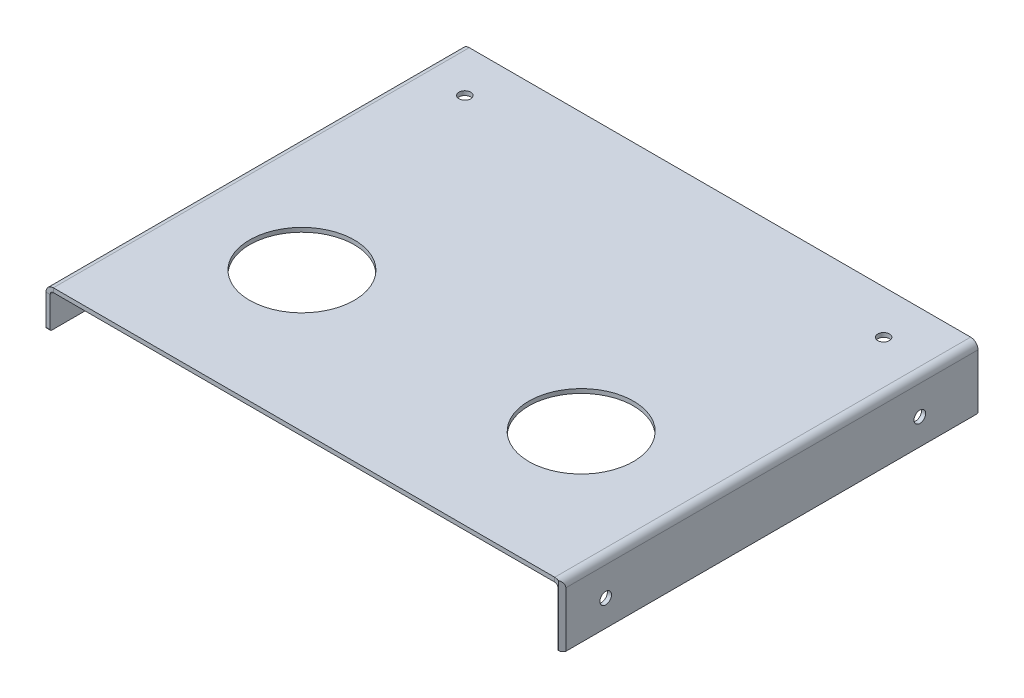
ISO-10303-21;
HEADER;
FILE_DESCRIPTION(('STEP AP214'),'2;1');
FILE_NAME('part.step','',(''),(''),'','','');
FILE_SCHEMA(('AUTOMOTIVE_DESIGN { 1 0 10303 214 1 1 1 1 }'));
ENDSEC;
DATA;
#1=APPLICATION_CONTEXT('core data for automotive mechanical design processes');
#2=APPLICATION_PROTOCOL_DEFINITION('international standard','automotive_design',2000,#1);
#3=PRODUCT_CONTEXT('',#1,'mechanical');
#4=PRODUCT('Part','Part','',(#3));
#5=PRODUCT_RELATED_PRODUCT_CATEGORY('part','',(#4));
#6=PRODUCT_DEFINITION_FORMATION('','',#4);
#7=PRODUCT_DEFINITION_CONTEXT('part definition',#1,'design');
#8=PRODUCT_DEFINITION('design','',#6,#7);
#9=PRODUCT_DEFINITION_SHAPE('','',#8);
#10=(LENGTH_UNIT() NAMED_UNIT(*) SI_UNIT(.MILLI.,.METRE.));
#11=(NAMED_UNIT(*) PLANE_ANGLE_UNIT() SI_UNIT($,.RADIAN.));
#12=(NAMED_UNIT(*) SI_UNIT($,.STERADIAN.) SOLID_ANGLE_UNIT());
#13=UNCERTAINTY_MEASURE_WITH_UNIT(LENGTH_MEASURE(1.E-05),#10,'distance_accuracy_value','');
#14=(GEOMETRIC_REPRESENTATION_CONTEXT(3) GLOBAL_UNCERTAINTY_ASSIGNED_CONTEXT((#13)) GLOBAL_UNIT_ASSIGNED_CONTEXT((#10,
#11,#12)) REPRESENTATION_CONTEXT('',''));
#15=CARTESIAN_POINT('',(0.,0.,0.));
#16=DIRECTION('',(0.,0.,1.));
#17=DIRECTION('',(1.,0.,0.));
#18=AXIS2_PLACEMENT_3D('',#15,#16,#17);
#19=CARTESIAN_POINT('',(139.7,-1.7272,-227.0252));
#20=DIRECTION('',(0.,0.,-1.));
#21=DIRECTION('',(-1.,0.,0.));
#22=AXIS2_PLACEMENT_3D('',#19,#20,#21);
#23=PLANE('',#22);
#24=DIRECTION('',(1.,0.,0.));
#25=VECTOR('',#24,1.);
#26=CARTESIAN_POINT('',(139.7,-1.7272,-227.0252));
#27=LINE('',#26,#25);
#28=CARTESIAN_POINT('',(139.7,-1.7272,-227.0252));
#29=VERTEX_POINT('',#28);
#30=CARTESIAN_POINT('',(141.986,-1.7272,-227.0252));
#31=VERTEX_POINT('',#30);
#32=EDGE_CURVE('E249',#29,#31,#27,.T.);
#33=ORIENTED_EDGE('',*,*,#32,.F.);
#34=CARTESIAN_POINT('',(137.9728,-1.7272,-227.0252));
#35=DIRECTION('',(0.,0.,-1.));
#36=DIRECTION('',(-1.,0.,0.));
#37=AXIS2_PLACEMENT_3D('',#34,#35,#36);
#38=CIRCLE('',#37,1.7272);
#39=CARTESIAN_POINT('',(137.9728,0.,-227.0252));
#40=VERTEX_POINT('',#39);
#41=EDGE_CURVE('E349',#29,#40,#38,.F.);
#42=ORIENTED_EDGE('',*,*,#41,.T.);
#43=DIRECTION('',(0.,-1.,0.));
#44=VECTOR('',#43,1.);
#45=CARTESIAN_POINT('',(137.9728,2.286,-227.0252));
#46=LINE('',#45,#44);
#47=CARTESIAN_POINT('',(137.9728,2.286,-227.0252));
#48=VERTEX_POINT('',#47);
#49=EDGE_CURVE('E247',#48,#40,#46,.T.);
#50=ORIENTED_EDGE('',*,*,#49,.F.);
#51=CARTESIAN_POINT('',(137.9728,-1.7272,-227.0252));
#52=DIRECTION('',(0.,0.,-1.));
#53=DIRECTION('',(-1.,0.,0.));
#54=AXIS2_PLACEMENT_3D('',#51,#52,#53);
#55=CIRCLE('',#54,4.0132);
#56=EDGE_CURVE('E366',#31,#48,#55,.F.);
#57=ORIENTED_EDGE('',*,*,#56,.F.);
#58=EDGE_LOOP('',(#33,#42,#50,#57));
#59=FACE_BOUND('',#58,.T.);
#60=ADVANCED_FACE('F66',(#59),#23,.T.);
#61=CARTESIAN_POINT('',(137.9728,2.286,-227.0252));
#62=DIRECTION('',(0.,0.,-1.));
#63=DIRECTION('',(-1.,0.,0.));
#64=AXIS2_PLACEMENT_3D('',#61,#62,#63);
#65=PLANE('',#64);
#66=DIRECTION('',(0.,1.,0.));
#67=VECTOR('',#66,1.);
#68=CARTESIAN_POINT('',(141.986,-31.75,-227.0252));
#69=LINE('',#68,#67);
#70=CARTESIAN_POINT('',(141.986,-30.988,-227.0252));
#71=VERTEX_POINT('',#70);
#72=EDGE_CURVE('E401',#71,#31,#69,.T.);
#73=ORIENTED_EDGE('',*,*,#72,.F.);
#74=DIRECTION('',(1.,0.,0.));
#75=VECTOR('',#74,1.);
#76=CARTESIAN_POINT('',(137.9728,-30.988,-227.0252));
#77=LINE('',#76,#75);
#78=CARTESIAN_POINT('',(139.7,-30.988,-227.0252));
#79=VERTEX_POINT('',#78);
#80=EDGE_CURVE('E272',#71,#79,#77,.F.);
#81=ORIENTED_EDGE('',*,*,#80,.T.);
#82=DIRECTION('',(0.,1.,0.));
#83=VECTOR('',#82,1.);
#84=CARTESIAN_POINT('',(139.7,-31.75,-227.0252));
#85=LINE('',#84,#83);
#86=EDGE_CURVE('E397',#79,#29,#85,.T.);
#87=ORIENTED_EDGE('',*,*,#86,.T.);
#88=ORIENTED_EDGE('',*,*,#32,.T.);
#89=EDGE_LOOP('',(#73,#81,#87,#88));
#90=FACE_BOUND('',#89,.T.);
#91=ADVANCED_FACE('F452',(#90),#65,.T.);
#92=CARTESIAN_POINT('',(137.9728,0.,0.));
#93=DIRECTION('',(0.,0.,1.));
#94=DIRECTION('',(1.,0.,0.));
#95=AXIS2_PLACEMENT_3D('',#92,#93,#94);
#96=PLANE('',#95);
#97=DIRECTION('',(0.,-1.,0.));
#98=VECTOR('',#97,1.);
#99=CARTESIAN_POINT('',(139.954306855169,0.,0.));
#100=LINE('',#99,#98);
#101=CARTESIAN_POINT('',(139.954306855169,1.76270040300824,0.));
#102=VERTEX_POINT('',#101);
#103=CARTESIAN_POINT('',(139.954306855169,-1.7272,0.));
#104=VERTEX_POINT('',#103);
#105=EDGE_CURVE('E436',#102,#104,#100,.T.);
#106=ORIENTED_EDGE('',*,*,#105,.F.);
#107=CARTESIAN_POINT('',(137.9728,-1.7272,0.));
#108=DIRECTION('',(0.,0.,-1.));
#109=DIRECTION('',(-1.,0.,0.));
#110=AXIS2_PLACEMENT_3D('',#107,#108,#109);
#111=CIRCLE('',#110,4.0132);
#112=CARTESIAN_POINT('',(137.9728,2.286,0.));
#113=VERTEX_POINT('',#112);
#114=EDGE_CURVE('E319',#102,#113,#111,.F.);
#115=ORIENTED_EDGE('',*,*,#114,.T.);
#116=DIRECTION('',(0.,1.,0.));
#117=VECTOR('',#116,1.);
#118=CARTESIAN_POINT('',(137.9728,0.,0.));
#119=LINE('',#118,#117);
#120=CARTESIAN_POINT('',(137.9728,0.,0.));
#121=VERTEX_POINT('',#120);
#122=EDGE_CURVE('E244',#121,#113,#119,.T.);
#123=ORIENTED_EDGE('',*,*,#122,.F.);
#124=CARTESIAN_POINT('',(137.9728,-1.7272,0.));
#125=DIRECTION('',(0.,0.,-1.));
#126=DIRECTION('',(-1.,0.,0.));
#127=AXIS2_PLACEMENT_3D('',#124,#125,#126);
#128=CIRCLE('',#127,1.7272);
#129=CARTESIAN_POINT('',(139.7,-1.7272,0.));
#130=VERTEX_POINT('',#129);
#131=EDGE_CURVE('E324',#130,#121,#128,.F.);
#132=ORIENTED_EDGE('',*,*,#131,.F.);
#133=DIRECTION('',(-1.,0.,0.));
#134=VECTOR('',#133,1.);
#135=CARTESIAN_POINT('',(141.986,-1.7272,0.));
#136=LINE('',#135,#134);
#137=EDGE_CURVE('E242',#104,#130,#136,.T.);
#138=ORIENTED_EDGE('',*,*,#137,.F.);
#139=EDGE_LOOP('',(#106,#115,#123,#132,#138));
#140=FACE_BOUND('',#139,.T.);
#141=ADVANCED_FACE('F355',(#140),#96,.T.);
#142=CARTESIAN_POINT('',(141.986,-1.7272,0.));
#143=DIRECTION('',(0.,0.,1.));
#144=DIRECTION('',(1.,0.,0.));
#145=AXIS2_PLACEMENT_3D('',#142,#143,#144);
#146=PLANE('',#145);
#147=DIRECTION('',(-1.,0.,0.));
#148=VECTOR('',#147,1.);
#149=CARTESIAN_POINT('',(139.7,0.,0.));
#150=LINE('',#149,#148);
#151=CARTESIAN_POINT('',(-135.6868,0.,0.));
#152=VERTEX_POINT('',#151);
#153=EDGE_CURVE('E327',#121,#152,#150,.T.);
#154=ORIENTED_EDGE('',*,*,#153,.F.);
#155=ORIENTED_EDGE('',*,*,#122,.T.);
#156=DIRECTION('',(-1.,0.,0.));
#157=VECTOR('',#156,1.);
#158=CARTESIAN_POINT('',(139.7,2.286,0.));
#159=LINE('',#158,#157);
#160=CARTESIAN_POINT('',(-135.6868,2.286,0.));
#161=VERTEX_POINT('',#160);
#162=EDGE_CURVE('E316',#113,#161,#159,.T.);
#163=ORIENTED_EDGE('',*,*,#162,.T.);
#164=DIRECTION('',(0.,-1.,0.));
#165=VECTOR('',#164,1.);
#166=CARTESIAN_POINT('',(-135.6868,2.286,0.));
#167=LINE('',#166,#165);
#168=EDGE_CURVE('E234',#161,#152,#167,.T.);
#169=ORIENTED_EDGE('',*,*,#168,.T.);
#170=EDGE_LOOP('',(#154,#155,#163,#169));
#171=FACE_BOUND('',#170,.T.);
#172=ADVANCED_FACE('F359',(#171),#146,.T.);
#173=CARTESIAN_POINT('',(-135.6868,0.,-227.0252));
#174=DIRECTION('',(0.,0.,-1.));
#175=DIRECTION('',(-1.,0.,0.));
#176=AXIS2_PLACEMENT_3D('',#173,#174,#175);
#177=PLANE('',#176);
#178=DIRECTION('',(0.,1.,0.));
#179=VECTOR('',#178,1.);
#180=CARTESIAN_POINT('',(-135.6868,0.,-227.0252));
#181=LINE('',#180,#179);
#182=CARTESIAN_POINT('',(-135.6868,0.,-227.0252));
#183=VERTEX_POINT('',#182);
#184=CARTESIAN_POINT('',(-135.6868,2.286,-227.0252));
#185=VERTEX_POINT('',#184);
#186=EDGE_CURVE('E240',#183,#185,#181,.T.);
#187=ORIENTED_EDGE('',*,*,#186,.F.);
#188=CARTESIAN_POINT('',(-135.6868,-1.7272,-227.0252));
#189=DIRECTION('',(0.,0.,-1.));
#190=DIRECTION('',(-1.,0.,0.));
#191=AXIS2_PLACEMENT_3D('',#188,#189,#190);
#192=CIRCLE('',#191,1.7272);
#193=CARTESIAN_POINT('',(-137.414,-1.7272,-227.0252));
#194=VERTEX_POINT('',#193);
#195=EDGE_CURVE('E311',#183,#194,#192,.F.);
#196=ORIENTED_EDGE('',*,*,#195,.T.);
#197=DIRECTION('',(1.,0.,0.));
#198=VECTOR('',#197,1.);
#199=CARTESIAN_POINT('',(-139.7,-1.7272,-227.0252));
#200=LINE('',#199,#198);
#201=CARTESIAN_POINT('',(-139.7,-1.7272,-227.0252));
#202=VERTEX_POINT('',#201);
#203=EDGE_CURVE('E238',#202,#194,#200,.T.);
#204=ORIENTED_EDGE('',*,*,#203,.F.);
#205=CARTESIAN_POINT('',(-135.6868,-1.7272,-227.0252));
#206=DIRECTION('',(0.,0.,-1.));
#207=DIRECTION('',(-1.,0.,0.));
#208=AXIS2_PLACEMENT_3D('',#205,#206,#207);
#209=CIRCLE('',#208,4.0132);
#210=EDGE_CURVE('E405',#185,#202,#209,.F.);
#211=ORIENTED_EDGE('',*,*,#210,.F.);
#212=EDGE_LOOP('',(#187,#196,#204,#211));
#213=FACE_BOUND('',#212,.T.);
#214=ADVANCED_FACE('F456',(#213),#177,.T.);
#215=CARTESIAN_POINT('',(-139.7,-1.7272,-227.0252));
#216=DIRECTION('',(0.,0.,-1.));
#217=DIRECTION('',(-1.,0.,0.));
#218=AXIS2_PLACEMENT_3D('',#215,#216,#217);
#219=PLANE('',#218);
#220=DIRECTION('',(-1.,0.,0.));
#221=VECTOR('',#220,1.);
#222=CARTESIAN_POINT('',(139.7,0.,-227.0252));
#223=LINE('',#222,#221);
#224=EDGE_CURVE('E391',#40,#183,#223,.T.);
#225=ORIENTED_EDGE('',*,*,#224,.T.);
#226=ORIENTED_EDGE('',*,*,#186,.T.);
#227=DIRECTION('',(-1.,0.,0.));
#228=VECTOR('',#227,1.);
#229=CARTESIAN_POINT('',(139.7,2.286,-227.0252));
#230=LINE('',#229,#228);
#231=EDGE_CURVE('E373',#48,#185,#230,.T.);
#232=ORIENTED_EDGE('',*,*,#231,.F.);
#233=ORIENTED_EDGE('',*,*,#49,.T.);
#234=EDGE_LOOP('',(#225,#226,#232,#233));
#235=FACE_BOUND('',#234,.T.);
#236=ADVANCED_FACE('F455',(#235),#219,.T.);
#237=CARTESIAN_POINT('',(-137.414,-1.7272,0.));
#238=DIRECTION('',(0.,0.,1.));
#239=DIRECTION('',(1.,0.,0.));
#240=AXIS2_PLACEMENT_3D('',#237,#238,#239);
#241=PLANE('',#240);
#242=DIRECTION('',(-1.,0.,0.));
#243=VECTOR('',#242,1.);
#244=CARTESIAN_POINT('',(-137.414,-1.7272,0.));
#245=LINE('',#244,#243);
#246=CARTESIAN_POINT('',(-137.414,-1.7272,0.));
#247=VERTEX_POINT('',#246);
#248=CARTESIAN_POINT('',(-139.7,-1.7272,0.));
#249=VERTEX_POINT('',#248);
#250=EDGE_CURVE('E236',#247,#249,#245,.T.);
#251=ORIENTED_EDGE('',*,*,#250,.F.);
#252=CARTESIAN_POINT('',(-135.6868,-1.7272,0.));
#253=DIRECTION('',(0.,0.,-1.));
#254=DIRECTION('',(-1.,0.,0.));
#255=AXIS2_PLACEMENT_3D('',#252,#253,#254);
#256=CIRCLE('',#255,1.7272);
#257=EDGE_CURVE('E331',#152,#247,#256,.F.);
#258=ORIENTED_EDGE('',*,*,#257,.F.);
#259=ORIENTED_EDGE('',*,*,#168,.F.);
#260=CARTESIAN_POINT('',(-135.6868,-1.7272,0.));
#261=DIRECTION('',(0.,0.,-1.));
#262=DIRECTION('',(-1.,0.,0.));
#263=AXIS2_PLACEMENT_3D('',#260,#261,#262);
#264=CIRCLE('',#263,4.0132);
#265=EDGE_CURVE('E305',#161,#249,#264,.F.);
#266=ORIENTED_EDGE('',*,*,#265,.T.);
#267=EDGE_LOOP('',(#251,#258,#259,#266));
#268=FACE_BOUND('',#267,.T.);
#269=ADVANCED_FACE('F380',(#268),#241,.T.);
#270=CARTESIAN_POINT('',(-135.6868,2.286,0.));
#271=DIRECTION('',(0.,0.,1.));
#272=DIRECTION('',(1.,0.,0.));
#273=AXIS2_PLACEMENT_3D('',#270,#271,#272);
#274=PLANE('',#273);
#275=DIRECTION('',(0.,1.,0.));
#276=VECTOR('',#275,1.);
#277=CARTESIAN_POINT('',(-139.7,0.,0.));
#278=LINE('',#277,#276);
#279=CARTESIAN_POINT('',(-139.7,-18.288,0.));
#280=VERTEX_POINT('',#279);
#281=EDGE_CURVE('E294',#249,#280,#278,.F.);
#282=ORIENTED_EDGE('',*,*,#281,.T.);
#283=DIRECTION('',(1.,0.,0.));
#284=VECTOR('',#283,1.);
#285=CARTESIAN_POINT('',(-135.6868,-18.288,0.));
#286=LINE('',#285,#284);
#287=CARTESIAN_POINT('',(-137.414,-18.288,0.));
#288=VERTEX_POINT('',#287);
#289=EDGE_CURVE('E74',#280,#288,#286,.T.);
#290=ORIENTED_EDGE('',*,*,#289,.T.);
#291=DIRECTION('',(0.,-1.,0.));
#292=VECTOR('',#291,1.);
#293=CARTESIAN_POINT('',(-137.414,0.,0.));
#294=LINE('',#293,#292);
#295=EDGE_CURVE('E293',#247,#288,#294,.T.);
#296=ORIENTED_EDGE('',*,*,#295,.F.);
#297=ORIENTED_EDGE('',*,*,#250,.T.);
#298=EDGE_LOOP('',(#282,#290,#296,#297));
#299=FACE_BOUND('',#298,.T.);
#300=ADVANCED_FACE('F292',(#299),#274,.T.);
#301=CARTESIAN_POINT('',(-137.414,0.,-227.0252));
#302=DIRECTION('',(-1.,0.,0.));
#303=DIRECTION('',(0.,0.,1.));
#304=AXIS2_PLACEMENT_3D('',#301,#302,#303);
#305=PLANE('',#304);
#306=DIRECTION('',(0.,0.,1.));
#307=VECTOR('',#306,1.);
#308=CARTESIAN_POINT('',(-137.414,-19.05,-227.0252));
#309=LINE('',#308,#307);
#310=CARTESIAN_POINT('',(-137.414,-19.05,-226.2632));
#311=VERTEX_POINT('',#310);
#312=CARTESIAN_POINT('',(-137.414,-19.05,-0.762000000000013));
#313=VERTEX_POINT('',#312);
#314=EDGE_CURVE('E231',#311,#313,#309,.T.);
#315=ORIENTED_EDGE('',*,*,#314,.F.);
#316=CARTESIAN_POINT('',(-137.414,-18.288,-226.2632));
#317=DIRECTION('',(-1.,0.,0.));
#318=DIRECTION('',(0.,0.,1.));
#319=AXIS2_PLACEMENT_3D('',#316,#317,#318);
#320=CIRCLE('',#319,0.762);
#321=CARTESIAN_POINT('',(-137.414,-18.288,-227.0252));
#322=VERTEX_POINT('',#321);
#323=EDGE_CURVE('E281',#311,#322,#320,.F.);
#324=ORIENTED_EDGE('',*,*,#323,.T.);
#325=DIRECTION('',(0.,-1.,0.));
#326=VECTOR('',#325,1.);
#327=CARTESIAN_POINT('',(-137.414,0.,-227.0252));
#328=LINE('',#327,#326);
#329=EDGE_CURVE('E334',#194,#322,#328,.T.);
#330=ORIENTED_EDGE('',*,*,#329,.F.);
#331=DIRECTION('',(0.,0.,1.));
#332=VECTOR('',#331,1.);
#333=CARTESIAN_POINT('',(-137.414,-1.7272,-227.0252));
#334=LINE('',#333,#332);
#335=EDGE_CURVE('E302',#194,#247,#334,.T.);
#336=ORIENTED_EDGE('',*,*,#335,.T.);
#337=ORIENTED_EDGE('',*,*,#295,.T.);
#338=CARTESIAN_POINT('',(-137.414,-18.288,-0.762));
#339=DIRECTION('',(-1.,0.,0.));
#340=DIRECTION('',(0.,0.,1.));
#341=AXIS2_PLACEMENT_3D('',#338,#339,#340);
#342=CIRCLE('',#341,0.762);
#343=EDGE_CURVE('E279',#288,#313,#342,.F.);
#344=ORIENTED_EDGE('',*,*,#343,.T.);
#345=EDGE_LOOP('',(#315,#324,#330,#336,#337,#344));
#346=FACE_BOUND('',#345,.T.);
#347=ADVANCED_FACE('F299',(#346),#305,.F.);
#348=CARTESIAN_POINT('',(-139.7,-19.05,-227.0252));
#349=DIRECTION('',(0.,-1.,0.));
#350=DIRECTION('',(0.,0.,-1.));
#351=AXIS2_PLACEMENT_3D('',#348,#349,#350);
#352=PLANE('',#351);
#353=DIRECTION('',(0.,0.,1.));
#354=VECTOR('',#353,1.);
#355=CARTESIAN_POINT('',(-139.7,-19.05,-227.0252));
#356=LINE('',#355,#354);
#357=CARTESIAN_POINT('',(-139.7,-19.05,-226.2632));
#358=VERTEX_POINT('',#357);
#359=CARTESIAN_POINT('',(-139.7,-19.05,-0.762000000000013));
#360=VERTEX_POINT('',#359);
#361=EDGE_CURVE('E229',#358,#360,#356,.T.);
#362=ORIENTED_EDGE('',*,*,#361,.F.);
#363=DIRECTION('',(1.,0.,0.));
#364=VECTOR('',#363,1.);
#365=CARTESIAN_POINT('',(-139.7,-19.05,-226.2632));
#366=LINE('',#365,#364);
#367=EDGE_CURVE('E276',#358,#311,#366,.T.);
#368=ORIENTED_EDGE('',*,*,#367,.T.);
#369=ORIENTED_EDGE('',*,*,#314,.T.);
#370=DIRECTION('',(1.,0.,0.));
#371=VECTOR('',#370,1.);
#372=CARTESIAN_POINT('',(-139.7,-19.05,-0.762000000000013));
#373=LINE('',#372,#371);
#374=EDGE_CURVE('E274',#313,#360,#373,.F.);
#375=ORIENTED_EDGE('',*,*,#374,.T.);
#376=EDGE_LOOP('',(#362,#368,#369,#375));
#377=FACE_BOUND('',#376,.T.);
#378=ADVANCED_FACE('F468',(#377),#352,.T.);
#379=CARTESIAN_POINT('',(-139.7,0.,-227.0252));
#380=DIRECTION('',(-1.,0.,0.));
#381=DIRECTION('',(0.,0.,1.));
#382=AXIS2_PLACEMENT_3D('',#379,#380,#381);
#383=PLANE('',#382);
#384=DIRECTION('',(0.,1.,0.));
#385=VECTOR('',#384,1.);
#386=CARTESIAN_POINT('',(-139.7,0.,-227.0252));
#387=LINE('',#386,#385);
#388=CARTESIAN_POINT('',(-139.7,-18.288,-227.0252));
#389=VERTEX_POINT('',#388);
#390=EDGE_CURVE('E407',#202,#389,#387,.F.);
#391=ORIENTED_EDGE('',*,*,#390,.T.);
#392=CARTESIAN_POINT('',(-139.7,-18.288,-226.2632));
#393=DIRECTION('',(-1.,0.,0.));
#394=DIRECTION('',(0.,0.,1.));
#395=AXIS2_PLACEMENT_3D('',#392,#393,#394);
#396=CIRCLE('',#395,0.762);
#397=EDGE_CURVE('E286',#389,#358,#396,.T.);
#398=ORIENTED_EDGE('',*,*,#397,.T.);
#399=ORIENTED_EDGE('',*,*,#361,.T.);
#400=CARTESIAN_POINT('',(-139.7,-18.288,-0.762));
#401=DIRECTION('',(-1.,0.,0.));
#402=DIRECTION('',(0.,0.,1.));
#403=AXIS2_PLACEMENT_3D('',#400,#401,#402);
#404=CIRCLE('',#403,0.762);
#405=EDGE_CURVE('E88',#360,#280,#404,.T.);
#406=ORIENTED_EDGE('',*,*,#405,.T.);
#407=ORIENTED_EDGE('',*,*,#281,.F.);
#408=DIRECTION('',(0.,0.,1.));
#409=VECTOR('',#408,1.);
#410=CARTESIAN_POINT('',(-139.7,-1.7272,-227.0252));
#411=LINE('',#410,#409);
#412=EDGE_CURVE('E226',#202,#249,#411,.T.);
#413=ORIENTED_EDGE('',*,*,#412,.F.);
#414=EDGE_LOOP('',(#391,#398,#399,#406,#407,#413));
#415=FACE_BOUND('',#414,.T.);
#416=ADVANCED_FACE('F459',(#415),#383,.T.);
#417=CARTESIAN_POINT('',(-135.6868,-1.7272,-227.0252));
#418=DIRECTION('',(0.,0.,1.));
#419=DIRECTION('',(1.,0.,0.));
#420=AXIS2_PLACEMENT_3D('',#417,#418,#419);
#421=CYLINDRICAL_SURFACE('',#420,4.0132);
#422=ORIENTED_EDGE('',*,*,#265,.F.);
#423=DIRECTION('',(0.,0.,1.));
#424=VECTOR('',#423,1.);
#425=CARTESIAN_POINT('',(-135.6868,2.286,-227.0252));
#426=LINE('',#425,#424);
#427=EDGE_CURVE('E223',#185,#161,#426,.T.);
#428=ORIENTED_EDGE('',*,*,#427,.F.);
#429=ORIENTED_EDGE('',*,*,#210,.T.);
#430=ORIENTED_EDGE('',*,*,#412,.T.);
#431=EDGE_LOOP('',(#422,#428,#429,#430));
#432=FACE_BOUND('',#431,.T.);
#433=ADVANCED_FACE('F377',(#432),#421,.T.);
#434=CARTESIAN_POINT('',(139.7,2.286,-227.0252));
#435=DIRECTION('',(0.,1.,0.));
#436=DIRECTION('',(0.,0.,1.));
#437=AXIS2_PLACEMENT_3D('',#434,#435,#436);
#438=PLANE('',#437);
#439=CARTESIAN_POINT('',(-114.3,2.286,-203.2));
#440=DIRECTION('',(0.,1.,0.));
#441=DIRECTION('',(0.,0.,1.));
#442=AXIS2_PLACEMENT_3D('',#439,#440,#441);
#443=CIRCLE('',#442,3.175);
#444=CARTESIAN_POINT('',(-114.3,2.286,-200.025));
#445=VERTEX_POINT('',#444);
#446=EDGE_CURVE('E256',#445,#445,#443,.T.);
#447=ORIENTED_EDGE('',*,*,#446,.F.);
#448=EDGE_LOOP('',(#447));
#449=FACE_BOUND('',#448,.T.);
#450=CARTESIAN_POINT('',(114.3,2.286,-203.2));
#451=DIRECTION('',(0.,1.,0.));
#452=DIRECTION('',(0.,0.,1.));
#453=AXIS2_PLACEMENT_3D('',#450,#451,#452);
#454=CIRCLE('',#453,3.175);
#455=CARTESIAN_POINT('',(114.3,2.286,-200.025));
#456=VERTEX_POINT('',#455);
#457=EDGE_CURVE('E423',#456,#456,#454,.T.);
#458=ORIENTED_EDGE('',*,*,#457,.F.);
#459=EDGE_LOOP('',(#458));
#460=FACE_BOUND('',#459,.T.);
#461=CARTESIAN_POINT('',(76.2,2.286,-76.2));
#462=DIRECTION('',(0.,1.,0.));
#463=DIRECTION('',(0.,0.,1.));
#464=AXIS2_PLACEMENT_3D('',#461,#462,#463);
#465=CIRCLE('',#464,28.575);
#466=CARTESIAN_POINT('',(76.2,2.286,-47.625));
#467=VERTEX_POINT('',#466);
#468=EDGE_CURVE('E417',#467,#467,#465,.T.);
#469=ORIENTED_EDGE('',*,*,#468,.F.);
#470=EDGE_LOOP('',(#469));
#471=FACE_BOUND('',#470,.T.);
#472=CARTESIAN_POINT('',(-76.2,2.286,-76.2));
#473=DIRECTION('',(0.,1.,0.));
#474=DIRECTION('',(0.,0.,1.));
#475=AXIS2_PLACEMENT_3D('',#472,#473,#474);
#476=CIRCLE('',#475,28.575);
#477=CARTESIAN_POINT('',(-76.2,2.286,-47.625));
#478=VERTEX_POINT('',#477);
#479=EDGE_CURVE('E308',#478,#478,#476,.T.);
#480=ORIENTED_EDGE('',*,*,#479,.F.);
#481=EDGE_LOOP('',(#480));
#482=FACE_BOUND('',#481,.T.);
#483=ORIENTED_EDGE('',*,*,#162,.F.);
#484=DIRECTION('',(0.,0.,1.));
#485=VECTOR('',#484,1.);
#486=CARTESIAN_POINT('',(137.9728,2.286,-227.0252));
#487=LINE('',#486,#485);
#488=EDGE_CURVE('E214',#48,#113,#487,.T.);
#489=ORIENTED_EDGE('',*,*,#488,.F.);
#490=ORIENTED_EDGE('',*,*,#231,.T.);
#491=ORIENTED_EDGE('',*,*,#427,.T.);
#492=EDGE_LOOP('',(#483,#489,#490,#491));
#493=FACE_BOUND('',#492,.T.);
#494=ADVANCED_FACE('F370',(#449,#460,#471,#482,#493),#438,.T.);
#495=CARTESIAN_POINT('',(137.9728,-1.7272,-227.0252));
#496=DIRECTION('',(0.,0.,1.));
#497=DIRECTION('',(1.,0.,0.));
#498=AXIS2_PLACEMENT_3D('',#495,#496,#497);
#499=CYLINDRICAL_SURFACE('',#498,4.0132);
#500=CARTESIAN_POINT('',(137.9728,-1.7272,1.98150685516929));
#501=DIRECTION('',(-0.707106781186547,0.,-0.707106781186547));
#502=DIRECTION('',(-0.707106781186548,0.,0.707106781186548));
#503=AXIS2_PLACEMENT_3D('',#500,#501,#502);
#504=ELLIPSE('',#503,5.6755218685157,4.0132);
#505=CARTESIAN_POINT('',(141.986,-1.7272,-2.0316931448307));
#506=VERTEX_POINT('',#505);
#507=EDGE_CURVE('E205',#506,#102,#504,.F.);
#508=ORIENTED_EDGE('',*,*,#507,.F.);
#509=DIRECTION('',(0.,0.,1.));
#510=VECTOR('',#509,1.);
#511=CARTESIAN_POINT('',(141.986,-1.7272,-227.0252));
#512=LINE('',#511,#510);
#513=EDGE_CURVE('E203',#31,#506,#512,.T.);
#514=ORIENTED_EDGE('',*,*,#513,.F.);
#515=ORIENTED_EDGE('',*,*,#56,.T.);
#516=ORIENTED_EDGE('',*,*,#488,.T.);
#517=ORIENTED_EDGE('',*,*,#114,.F.);
#518=EDGE_LOOP('',(#508,#514,#515,#516,#517));
#519=FACE_BOUND('',#518,.T.);
#520=ADVANCED_FACE('F364',(#519),#499,.T.);
#521=CARTESIAN_POINT('',(141.986,-31.75,-227.0252));
#522=DIRECTION('',(1.,0.,0.));
#523=DIRECTION('',(0.,0.,-1.));
#524=AXIS2_PLACEMENT_3D('',#521,#522,#523);
#525=PLANE('',#524);
#526=DIRECTION('',(0.,1.,0.));
#527=VECTOR('',#526,1.);
#528=CARTESIAN_POINT('',(141.986,-31.75,-2.0316931448307));
#529=LINE('',#528,#527);
#530=CARTESIAN_POINT('',(141.986,-31.75,-2.03169314483072));
#531=VERTEX_POINT('',#530);
#532=EDGE_CURVE('E190',#531,#506,#529,.T.);
#533=ORIENTED_EDGE('',*,*,#532,.F.);
#534=DIRECTION('',(0.,0.,1.));
#535=VECTOR('',#534,1.);
#536=CARTESIAN_POINT('',(141.986,-31.75,-227.0252));
#537=LINE('',#536,#535);
#538=CARTESIAN_POINT('',(141.986,-31.75,-226.2632));
#539=VERTEX_POINT('',#538);
#540=EDGE_CURVE('E201',#539,#531,#537,.T.);
#541=ORIENTED_EDGE('',*,*,#540,.F.);
#542=CARTESIAN_POINT('',(141.986,-30.988,-226.2632));
#543=DIRECTION('',(1.,0.,0.));
#544=DIRECTION('',(0.,0.,-1.));
#545=AXIS2_PLACEMENT_3D('',#542,#543,#544);
#546=CIRCLE('',#545,0.762);
#547=EDGE_CURVE('E263',#539,#71,#546,.T.);
#548=ORIENTED_EDGE('',*,*,#547,.T.);
#549=ORIENTED_EDGE('',*,*,#72,.T.);
#550=ORIENTED_EDGE('',*,*,#513,.T.);
#551=EDGE_LOOP('',(#533,#541,#548,#549,#550));
#552=FACE_BOUND('',#551,.T.);
#553=CARTESIAN_POINT('',(141.986,-17.4752,-195.2752));
#554=DIRECTION('',(1.,0.,0.));
#555=DIRECTION('',(0.,0.,-1.));
#556=AXIS2_PLACEMENT_3D('',#553,#554,#555);
#557=CIRCLE('',#556,3.175);
#558=CARTESIAN_POINT('',(141.986,-17.4752,-198.4502));
#559=VERTEX_POINT('',#558);
#560=EDGE_CURVE('E204',#559,#559,#557,.T.);
#561=ORIENTED_EDGE('',*,*,#560,.F.);
#562=EDGE_LOOP('',(#561));
#563=FACE_BOUND('',#562,.T.);
#564=CARTESIAN_POINT('',(141.986,-17.4752,-23.8252));
#565=DIRECTION('',(1.,0.,0.));
#566=DIRECTION('',(0.,0.,-1.));
#567=AXIS2_PLACEMENT_3D('',#564,#565,#566);
#568=CIRCLE('',#567,3.175);
#569=CARTESIAN_POINT('',(141.986,-17.4752,-27.0002));
#570=VERTEX_POINT('',#569);
#571=EDGE_CURVE('E257',#570,#570,#568,.T.);
#572=ORIENTED_EDGE('',*,*,#571,.F.);
#573=EDGE_LOOP('',(#572));
#574=FACE_BOUND('',#573,.T.);
#575=ADVANCED_FACE('F199',(#552,#563,#574),#525,.T.);
#576=CARTESIAN_POINT('',(139.7,-31.75,-227.0252));
#577=DIRECTION('',(0.,-1.,0.));
#578=DIRECTION('',(0.,0.,-1.));
#579=AXIS2_PLACEMENT_3D('',#576,#577,#578);
#580=PLANE('',#579);
#581=DIRECTION('',(-0.707106781186547,0.,0.707106781186547));
#582=VECTOR('',#581,1.);
#583=CARTESIAN_POINT('',(150.619782865924,-31.75,-10.6654760107552));
#584=LINE('',#583,#582);
#585=CARTESIAN_POINT('',(140.716306855169,-31.75,-0.762000000000006));
#586=VERTEX_POINT('',#585);
#587=EDGE_CURVE('E187',#531,#586,#584,.T.);
#588=ORIENTED_EDGE('',*,*,#587,.T.);
#589=DIRECTION('',(1.,0.,0.));
#590=VECTOR('',#589,1.);
#591=CARTESIAN_POINT('',(139.7,-31.75,-0.762));
#592=LINE('',#591,#590);
#593=CARTESIAN_POINT('',(139.7,-31.75,-0.762000000000013));
#594=VERTEX_POINT('',#593);
#595=EDGE_CURVE('E266',#586,#594,#592,.F.);
#596=ORIENTED_EDGE('',*,*,#595,.T.);
#597=DIRECTION('',(0.,0.,1.));
#598=VECTOR('',#597,1.);
#599=CARTESIAN_POINT('',(139.7,-31.75,-227.0252));
#600=LINE('',#599,#598);
#601=CARTESIAN_POINT('',(139.7,-31.75,-226.2632));
#602=VERTEX_POINT('',#601);
#603=EDGE_CURVE('E212',#602,#594,#600,.T.);
#604=ORIENTED_EDGE('',*,*,#603,.F.);
#605=DIRECTION('',(1.,0.,0.));
#606=VECTOR('',#605,1.);
#607=CARTESIAN_POINT('',(139.7,-31.75,-226.2632));
#608=LINE('',#607,#606);
#609=EDGE_CURVE('E211',#602,#539,#608,.T.);
#610=ORIENTED_EDGE('',*,*,#609,.T.);
#611=ORIENTED_EDGE('',*,*,#540,.T.);
#612=EDGE_LOOP('',(#588,#596,#604,#610,#611));
#613=FACE_BOUND('',#612,.T.);
#614=ADVANCED_FACE('F208',(#613),#580,.T.);
#615=CARTESIAN_POINT('',(139.7,-31.75,-227.0252));
#616=DIRECTION('',(1.,0.,0.));
#617=DIRECTION('',(0.,0.,-1.));
#618=AXIS2_PLACEMENT_3D('',#615,#616,#617);
#619=PLANE('',#618);
#620=CARTESIAN_POINT('',(139.7,-17.4752,-195.2752));
#621=DIRECTION('',(1.,0.,0.));
#622=DIRECTION('',(0.,0.,-1.));
#623=AXIS2_PLACEMENT_3D('',#620,#621,#622);
#624=CIRCLE('',#623,3.175);
#625=CARTESIAN_POINT('',(139.7,-17.4752,-198.4502));
#626=VERTEX_POINT('',#625);
#627=EDGE_CURVE('E258',#626,#626,#624,.T.);
#628=ORIENTED_EDGE('',*,*,#627,.T.);
#629=EDGE_LOOP('',(#628));
#630=FACE_BOUND('',#629,.T.);
#631=CARTESIAN_POINT('',(139.7,-17.4752,-23.8252));
#632=DIRECTION('',(1.,0.,0.));
#633=DIRECTION('',(0.,0.,-1.));
#634=AXIS2_PLACEMENT_3D('',#631,#632,#633);
#635=CIRCLE('',#634,3.175);
#636=CARTESIAN_POINT('',(139.7,-17.4752,-27.0002));
#637=VERTEX_POINT('',#636);
#638=EDGE_CURVE('E253',#637,#637,#635,.T.);
#639=ORIENTED_EDGE('',*,*,#638,.T.);
#640=EDGE_LOOP('',(#639));
#641=FACE_BOUND('',#640,.T.);
#642=ORIENTED_EDGE('',*,*,#603,.T.);
#643=CARTESIAN_POINT('',(139.7,-30.988,-0.762));
#644=DIRECTION('',(1.,0.,0.));
#645=DIRECTION('',(0.,0.,-1.));
#646=AXIS2_PLACEMENT_3D('',#643,#644,#645);
#647=CIRCLE('',#646,0.762);
#648=CARTESIAN_POINT('',(139.7,-30.988,0.));
#649=VERTEX_POINT('',#648);
#650=EDGE_CURVE('E270',#594,#649,#647,.F.);
#651=ORIENTED_EDGE('',*,*,#650,.T.);
#652=DIRECTION('',(0.,1.,0.));
#653=VECTOR('',#652,1.);
#654=CARTESIAN_POINT('',(139.7,-31.75,0.));
#655=LINE('',#654,#653);
#656=EDGE_CURVE('E321',#649,#130,#655,.T.);
#657=ORIENTED_EDGE('',*,*,#656,.T.);
#658=DIRECTION('',(0.,0.,1.));
#659=VECTOR('',#658,1.);
#660=CARTESIAN_POINT('',(139.7,-1.7272,-227.0252));
#661=LINE('',#660,#659);
#662=EDGE_CURVE('E217',#29,#130,#661,.T.);
#663=ORIENTED_EDGE('',*,*,#662,.F.);
#664=ORIENTED_EDGE('',*,*,#86,.F.);
#665=CARTESIAN_POINT('',(139.7,-30.988,-226.2632));
#666=DIRECTION('',(1.,0.,0.));
#667=DIRECTION('',(0.,0.,-1.));
#668=AXIS2_PLACEMENT_3D('',#665,#666,#667);
#669=CIRCLE('',#668,0.762);
#670=EDGE_CURVE('E268',#79,#602,#669,.F.);
#671=ORIENTED_EDGE('',*,*,#670,.T.);
#672=EDGE_LOOP('',(#642,#651,#657,#663,#664,#671));
#673=FACE_BOUND('',#672,.T.);
#674=ADVANCED_FACE('F445',(#630,#641,#673),#619,.F.);
#675=CARTESIAN_POINT('',(137.9728,-1.7272,-227.0252));
#676=DIRECTION('',(0.,0.,1.));
#677=DIRECTION('',(1.,0.,0.));
#678=AXIS2_PLACEMENT_3D('',#675,#676,#677);
#679=CYLINDRICAL_SURFACE('',#678,1.7272);
#680=ORIENTED_EDGE('',*,*,#131,.T.);
#681=DIRECTION('',(0.,0.,1.));
#682=VECTOR('',#681,1.);
#683=CARTESIAN_POINT('',(137.9728,0.,-227.0252));
#684=LINE('',#683,#682);
#685=EDGE_CURVE('E339',#40,#121,#684,.T.);
#686=ORIENTED_EDGE('',*,*,#685,.F.);
#687=ORIENTED_EDGE('',*,*,#41,.F.);
#688=ORIENTED_EDGE('',*,*,#662,.T.);
#689=EDGE_LOOP('',(#680,#686,#687,#688));
#690=FACE_BOUND('',#689,.T.);
#691=ADVANCED_FACE('F346',(#690),#679,.F.);
#692=CARTESIAN_POINT('',(139.7,0.,-227.0252));
#693=DIRECTION('',(0.,1.,0.));
#694=DIRECTION('',(0.,0.,1.));
#695=AXIS2_PLACEMENT_3D('',#692,#693,#694);
#696=PLANE('',#695);
#697=CARTESIAN_POINT('',(-114.3,0.,-203.2));
#698=DIRECTION('',(0.,1.,0.));
#699=DIRECTION('',(0.,0.,1.));
#700=AXIS2_PLACEMENT_3D('',#697,#698,#699);
#701=CIRCLE('',#700,3.175);
#702=CARTESIAN_POINT('',(-114.3,0.,-200.025));
#703=VERTEX_POINT('',#702);
#704=EDGE_CURVE('E426',#703,#703,#701,.F.);
#705=ORIENTED_EDGE('',*,*,#704,.F.);
#706=EDGE_LOOP('',(#705));
#707=FACE_BOUND('',#706,.T.);
#708=CARTESIAN_POINT('',(114.3,0.,-203.2));
#709=DIRECTION('',(0.,1.,0.));
#710=DIRECTION('',(0.,0.,1.));
#711=AXIS2_PLACEMENT_3D('',#708,#709,#710);
#712=CIRCLE('',#711,3.175);
#713=CARTESIAN_POINT('',(114.3,0.,-200.025));
#714=VERTEX_POINT('',#713);
#715=EDGE_CURVE('E420',#714,#714,#712,.F.);
#716=ORIENTED_EDGE('',*,*,#715,.F.);
#717=EDGE_LOOP('',(#716));
#718=FACE_BOUND('',#717,.T.);
#719=CARTESIAN_POINT('',(76.2,0.,-76.2));
#720=DIRECTION('',(0.,1.,0.));
#721=DIRECTION('',(0.,0.,1.));
#722=AXIS2_PLACEMENT_3D('',#719,#720,#721);
#723=CIRCLE('',#722,28.575);
#724=CARTESIAN_POINT('',(76.2,0.,-47.625));
#725=VERTEX_POINT('',#724);
#726=EDGE_CURVE('E414',#725,#725,#723,.F.);
#727=ORIENTED_EDGE('',*,*,#726,.F.);
#728=EDGE_LOOP('',(#727));
#729=FACE_BOUND('',#728,.T.);
#730=CARTESIAN_POINT('',(-76.2,0.,-76.2));
#731=DIRECTION('',(0.,1.,0.));
#732=DIRECTION('',(0.,0.,1.));
#733=AXIS2_PLACEMENT_3D('',#730,#731,#732);
#734=CIRCLE('',#733,28.575);
#735=CARTESIAN_POINT('',(-76.2,0.,-47.625));
#736=VERTEX_POINT('',#735);
#737=EDGE_CURVE('E303',#736,#736,#734,.F.);
#738=ORIENTED_EDGE('',*,*,#737,.F.);
#739=EDGE_LOOP('',(#738));
#740=FACE_BOUND('',#739,.T.);
#741=ORIENTED_EDGE('',*,*,#153,.T.);
#742=DIRECTION('',(0.,0.,1.));
#743=VECTOR('',#742,1.);
#744=CARTESIAN_POINT('',(-135.6868,0.,-227.0252));
#745=LINE('',#744,#743);
#746=EDGE_CURVE('E336',#183,#152,#745,.T.);
#747=ORIENTED_EDGE('',*,*,#746,.F.);
#748=ORIENTED_EDGE('',*,*,#224,.F.);
#749=ORIENTED_EDGE('',*,*,#685,.T.);
#750=EDGE_LOOP('',(#741,#747,#748,#749));
#751=FACE_BOUND('',#750,.T.);
#752=ADVANCED_FACE('F384',(#707,#718,#729,#740,#751),#696,.F.);
#753=CARTESIAN_POINT('',(-135.6868,-1.7272,-227.0252));
#754=DIRECTION('',(0.,0.,1.));
#755=DIRECTION('',(1.,0.,0.));
#756=AXIS2_PLACEMENT_3D('',#753,#754,#755);
#757=CYLINDRICAL_SURFACE('',#756,1.7272);
#758=ORIENTED_EDGE('',*,*,#257,.T.);
#759=ORIENTED_EDGE('',*,*,#335,.F.);
#760=ORIENTED_EDGE('',*,*,#195,.F.);
#761=ORIENTED_EDGE('',*,*,#746,.T.);
#762=EDGE_LOOP('',(#758,#759,#760,#761));
#763=FACE_BOUND('',#762,.T.);
#764=ADVANCED_FACE('F388',(#763),#757,.F.);
#765=CARTESIAN_POINT('',(-135.6868,-1.7272,-227.0252));
#766=DIRECTION('',(0.,0.,-1.));
#767=DIRECTION('',(-1.,0.,0.));
#768=AXIS2_PLACEMENT_3D('',#765,#766,#767);
#769=PLANE('',#768);
#770=ORIENTED_EDGE('',*,*,#329,.T.);
#771=DIRECTION('',(1.,0.,0.));
#772=VECTOR('',#771,1.);
#773=CARTESIAN_POINT('',(-135.6868,-18.288,-227.0252));
#774=LINE('',#773,#772);
#775=EDGE_CURVE('E283',#322,#389,#774,.F.);
#776=ORIENTED_EDGE('',*,*,#775,.T.);
#777=ORIENTED_EDGE('',*,*,#390,.F.);
#778=ORIENTED_EDGE('',*,*,#203,.T.);
#779=EDGE_LOOP('',(#770,#776,#777,#778));
#780=FACE_BOUND('',#779,.T.);
#781=ADVANCED_FACE('F461',(#780),#769,.T.);
#782=CARTESIAN_POINT('',(-135.6868,-1.7272,0.));
#783=DIRECTION('',(0.,0.,-1.));
#784=DIRECTION('',(-1.,0.,0.));
#785=AXIS2_PLACEMENT_3D('',#782,#783,#784);
#786=PLANE('',#785);
#787=DIRECTION('',(1.,0.,0.));
#788=VECTOR('',#787,1.);
#789=CARTESIAN_POINT('',(141.986,-30.988,0.));
#790=LINE('',#789,#788);
#791=CARTESIAN_POINT('',(139.954306855169,-30.988,0.));
#792=VERTEX_POINT('',#791);
#793=EDGE_CURVE('E252',#649,#792,#790,.T.);
#794=ORIENTED_EDGE('',*,*,#793,.T.);
#795=DIRECTION('',(0.,1.,0.));
#796=VECTOR('',#795,1.);
#797=CARTESIAN_POINT('',(139.954306855169,-1.7272,0.));
#798=LINE('',#797,#796);
#799=EDGE_CURVE('E80',#792,#104,#798,.T.);
#800=ORIENTED_EDGE('',*,*,#799,.T.);
#801=ORIENTED_EDGE('',*,*,#137,.T.);
#802=ORIENTED_EDGE('',*,*,#656,.F.);
#803=EDGE_LOOP('',(#794,#800,#801,#802));
#804=FACE_BOUND('',#803,.T.);
#805=ADVANCED_FACE('F439',(#804),#786,.F.);
#806=CARTESIAN_POINT('',(-76.2,-31.751,-76.2));
#807=DIRECTION('',(0.,1.,0.));
#808=DIRECTION('',(0.,0.,1.));
#809=AXIS2_PLACEMENT_3D('',#806,#807,#808);
#810=CYLINDRICAL_SURFACE('',#809,28.575);
#811=ORIENTED_EDGE('',*,*,#479,.T.);
#812=EDGE_LOOP('',(#811));
#813=FACE_BOUND('',#812,.T.);
#814=ORIENTED_EDGE('',*,*,#737,.T.);
#815=EDGE_LOOP('',(#814));
#816=FACE_BOUND('',#815,.T.);
#817=ADVANCED_FACE('F550',(#813,#816),#810,.F.);
#818=CARTESIAN_POINT('',(76.2,-31.751,-76.2));
#819=DIRECTION('',(0.,1.,0.));
#820=DIRECTION('',(0.,0.,1.));
#821=AXIS2_PLACEMENT_3D('',#818,#819,#820);
#822=CYLINDRICAL_SURFACE('',#821,28.575);
#823=ORIENTED_EDGE('',*,*,#468,.T.);
#824=EDGE_LOOP('',(#823));
#825=FACE_BOUND('',#824,.T.);
#826=ORIENTED_EDGE('',*,*,#726,.T.);
#827=EDGE_LOOP('',(#826));
#828=FACE_BOUND('',#827,.T.);
#829=ADVANCED_FACE('F577',(#825,#828),#822,.F.);
#830=CARTESIAN_POINT('',(114.3,-31.751,-203.2));
#831=DIRECTION('',(0.,1.,0.));
#832=DIRECTION('',(0.,0.,1.));
#833=AXIS2_PLACEMENT_3D('',#830,#831,#832);
#834=CYLINDRICAL_SURFACE('',#833,3.175);
#835=ORIENTED_EDGE('',*,*,#457,.T.);
#836=EDGE_LOOP('',(#835));
#837=FACE_BOUND('',#836,.T.);
#838=ORIENTED_EDGE('',*,*,#715,.T.);
#839=EDGE_LOOP('',(#838));
#840=FACE_BOUND('',#839,.T.);
#841=ADVANCED_FACE('F581',(#837,#840),#834,.F.);
#842=CARTESIAN_POINT('',(-114.3,-31.751,-203.2));
#843=DIRECTION('',(0.,1.,0.));
#844=DIRECTION('',(0.,0.,1.));
#845=AXIS2_PLACEMENT_3D('',#842,#843,#844);
#846=CYLINDRICAL_SURFACE('',#845,3.175);
#847=ORIENTED_EDGE('',*,*,#446,.T.);
#848=EDGE_LOOP('',(#847));
#849=FACE_BOUND('',#848,.T.);
#850=ORIENTED_EDGE('',*,*,#704,.T.);
#851=EDGE_LOOP('',(#850));
#852=FACE_BOUND('',#851,.T.);
#853=ADVANCED_FACE('F612',(#849,#852),#846,.F.);
#854=CARTESIAN_POINT('',(134.366,-17.4752,-23.8252));
#855=DIRECTION('',(1.,0.,0.));
#856=DIRECTION('',(0.,0.,-1.));
#857=AXIS2_PLACEMENT_3D('',#854,#855,#856);
#858=CYLINDRICAL_SURFACE('',#857,3.175);
#859=CARTESIAN_POINT('',(141.986,-17.4752,-27.0002));
#860=CARTESIAN_POINT('',(141.9621875,-17.4752,-27.0002));
#861=CARTESIAN_POINT('',(141.938375,-17.4752,-27.0002));
#862=CARTESIAN_POINT('',(141.89075,-17.4752,-27.0002));
#863=CARTESIAN_POINT('',(141.8669375,-17.4752,-27.0002));
#864=CARTESIAN_POINT('',(141.8193125,-17.4752,-27.0002));
#865=CARTESIAN_POINT('',(141.7955,-17.4752,-27.0002));
#866=CARTESIAN_POINT('',(141.747875,-17.4752,-27.0002));
#867=CARTESIAN_POINT('',(141.7240625,-17.4752,-27.0002));
#868=CARTESIAN_POINT('',(141.6764375,-17.4752,-27.0002));
#869=CARTESIAN_POINT('',(141.652625,-17.4752,-27.0002));
#870=CARTESIAN_POINT('',(141.605,-17.4752,-27.0002));
#871=CARTESIAN_POINT('',(141.5811875,-17.4752,-27.0002));
#872=CARTESIAN_POINT('',(141.5335625,-17.4752,-27.0002));
#873=CARTESIAN_POINT('',(141.50975,-17.4752,-27.0002));
#874=CARTESIAN_POINT('',(141.462125,-17.4752,-27.0002));
#875=CARTESIAN_POINT('',(141.4383125,-17.4752,-27.0002));
#876=CARTESIAN_POINT('',(141.3906875,-17.4752,-27.0002));
#877=CARTESIAN_POINT('',(141.366875,-17.4752,-27.0002));
#878=CARTESIAN_POINT('',(141.31925,-17.4752,-27.0002));
#879=CARTESIAN_POINT('',(141.2954375,-17.4752,-27.0002));
#880=CARTESIAN_POINT('',(141.2478125,-17.4752,-27.0002));
#881=CARTESIAN_POINT('',(141.224,-17.4752,-27.0002));
#882=CARTESIAN_POINT('',(141.176375,-17.4752,-27.0002));
#883=CARTESIAN_POINT('',(141.1525625,-17.4752,-27.0002));
#884=CARTESIAN_POINT('',(141.1049375,-17.4752,-27.0002));
#885=CARTESIAN_POINT('',(141.081125,-17.4752,-27.0002));
#886=CARTESIAN_POINT('',(141.0335,-17.4752,-27.0002));
#887=CARTESIAN_POINT('',(141.0096875,-17.4752,-27.0002));
#888=CARTESIAN_POINT('',(140.9620625,-17.4752,-27.0002));
#889=CARTESIAN_POINT('',(140.93825,-17.4752,-27.0002));
#890=CARTESIAN_POINT('',(140.890625,-17.4752,-27.0002));
#891=CARTESIAN_POINT('',(140.8668125,-17.4752,-27.0002));
#892=CARTESIAN_POINT('',(140.8191875,-17.4752,-27.0002));
#893=CARTESIAN_POINT('',(140.795375,-17.4752,-27.0002));
#894=CARTESIAN_POINT('',(140.74775,-17.4752,-27.0002));
#895=CARTESIAN_POINT('',(140.7239375,-17.4752,-27.0002));
#896=CARTESIAN_POINT('',(140.6763125,-17.4752,-27.0002));
#897=CARTESIAN_POINT('',(140.6525,-17.4752,-27.0002));
#898=CARTESIAN_POINT('',(140.604875,-17.4752,-27.0002));
#899=CARTESIAN_POINT('',(140.5810625,-17.4752,-27.0002));
#900=CARTESIAN_POINT('',(140.5334375,-17.4752,-27.0002));
#901=CARTESIAN_POINT('',(140.509625,-17.4752,-27.0002));
#902=CARTESIAN_POINT('',(140.462,-17.4752,-27.0002));
#903=CARTESIAN_POINT('',(140.4381875,-17.4752,-27.0002));
#904=CARTESIAN_POINT('',(140.3905625,-17.4752,-27.0002));
#905=CARTESIAN_POINT('',(140.36675,-17.4752,-27.0002));
#906=CARTESIAN_POINT('',(140.319125,-17.4752,-27.0002));
#907=CARTESIAN_POINT('',(140.2953125,-17.4752,-27.0002));
#908=CARTESIAN_POINT('',(140.2476875,-17.4752,-27.0002));
#909=CARTESIAN_POINT('',(140.223875,-17.4752,-27.0002));
#910=CARTESIAN_POINT('',(140.17625,-17.4752,-27.0002));
#911=CARTESIAN_POINT('',(140.1524375,-17.4752,-27.0002));
#912=CARTESIAN_POINT('',(140.1048125,-17.4752,-27.0002));
#913=CARTESIAN_POINT('',(140.081,-17.4752,-27.0002));
#914=CARTESIAN_POINT('',(140.033375,-17.4752,-27.0002));
#915=CARTESIAN_POINT('',(140.0095625,-17.4752,-27.0002));
#916=CARTESIAN_POINT('',(139.9619375,-17.4752,-27.0002));
#917=CARTESIAN_POINT('',(139.938125,-17.4752,-27.0002));
#918=CARTESIAN_POINT('',(139.8905,-17.4752,-27.0002));
#919=CARTESIAN_POINT('',(139.8666875,-17.4752,-27.0002));
#920=CARTESIAN_POINT('',(139.8190625,-17.4752,-27.0002));
#921=CARTESIAN_POINT('',(139.79525,-17.4752,-27.0002));
#922=CARTESIAN_POINT('',(139.747625,-17.4752,-27.0002));
#923=CARTESIAN_POINT('',(139.7238125,-17.4752,-27.0002));
#924=CARTESIAN_POINT('',(139.7,-17.4752,-27.0002));
#925=B_SPLINE_CURVE_WITH_KNOTS('',3,(#859,#860,#861,#862,#863,#864,#865,#866,#867,#868,#869,
#870,#871,#872,#873,#874,#875,#876,#877,#878,#879,#880,#881,#882,#883,#884,#885,#886,#887,#888,
#889,#890,#891,#892,#893,#894,#895,#896,#897,#898,#899,#900,#901,#902,#903,#904,#905,#906,#907,
#908,#909,#910,#911,#912,#913,#914,#915,#916,#917,#918,#919,#920,#921,#922,#923,#924),
.UNSPECIFIED.,.F.,.F.,(4,2,2,2,2,2,2,2,2,2,2,2,2,2,2,2,2,2,2,2,2,2,2,2,2,2,2,2,2,2,2,2,4),(0.,
0.0714374999999934,0.142874999999987,0.21431249999998,0.285750000000001,0.357187499999995,
0.428624999999988,0.500062499999981,0.571500000000003,0.642937499999996,0.714374999999989,
0.785812499999983,0.857250000000004,0.928687499999997,1.00012499999999,1.07156249999998,
1.14300000000001,1.2144375,1.28587499999999,1.35731249999999,1.42875000000001,1.5001875,
1.57162499999999,1.64306249999999,1.71450000000001,1.7859375,1.85737499999999,1.92881249999999,
2.00025000000001,2.0716875,2.143125,2.21456249999999,2.28600000000001),.UNSPECIFIED.);
#926=EDGE_CURVE('BSEAM623',#570,#637,#925,.T.);
#927=ORIENTED_EDGE('',*,*,#571,.T.);
#928=ORIENTED_EDGE('',*,*,#638,.F.);
#929=ORIENTED_EDGE('',*,*,#926,.T.);
#930=ORIENTED_EDGE('',*,*,#926,.F.);
#931=EDGE_LOOP('',(#927,#929,#928,#930));
#932=FACE_BOUND('',#931,.T.);
#933=ADVANCED_FACE('F623',(#932),#858,.F.);
#934=CARTESIAN_POINT('',(134.366,-17.4752,-195.2752));
#935=DIRECTION('',(1.,0.,0.));
#936=DIRECTION('',(0.,0.,-1.));
#937=AXIS2_PLACEMENT_3D('',#934,#935,#936);
#938=CYLINDRICAL_SURFACE('',#937,3.175);
#939=CARTESIAN_POINT('',(141.986,-17.4752,-198.4502));
#940=CARTESIAN_POINT('',(141.9621875,-17.4752,-198.4502));
#941=CARTESIAN_POINT('',(141.938375,-17.4752,-198.4502));
#942=CARTESIAN_POINT('',(141.89075,-17.4752,-198.4502));
#943=CARTESIAN_POINT('',(141.8669375,-17.4752,-198.4502));
#944=CARTESIAN_POINT('',(141.8193125,-17.4752,-198.4502));
#945=CARTESIAN_POINT('',(141.7955,-17.4752,-198.4502));
#946=CARTESIAN_POINT('',(141.747875,-17.4752,-198.4502));
#947=CARTESIAN_POINT('',(141.7240625,-17.4752,-198.4502));
#948=CARTESIAN_POINT('',(141.6764375,-17.4752,-198.4502));
#949=CARTESIAN_POINT('',(141.652625,-17.4752,-198.4502));
#950=CARTESIAN_POINT('',(141.605,-17.4752,-198.4502));
#951=CARTESIAN_POINT('',(141.5811875,-17.4752,-198.4502));
#952=CARTESIAN_POINT('',(141.5335625,-17.4752,-198.4502));
#953=CARTESIAN_POINT('',(141.50975,-17.4752,-198.4502));
#954=CARTESIAN_POINT('',(141.462125,-17.4752,-198.4502));
#955=CARTESIAN_POINT('',(141.4383125,-17.4752,-198.4502));
#956=CARTESIAN_POINT('',(141.3906875,-17.4752,-198.4502));
#957=CARTESIAN_POINT('',(141.366875,-17.4752,-198.4502));
#958=CARTESIAN_POINT('',(141.31925,-17.4752,-198.4502));
#959=CARTESIAN_POINT('',(141.2954375,-17.4752,-198.4502));
#960=CARTESIAN_POINT('',(141.2478125,-17.4752,-198.4502));
#961=CARTESIAN_POINT('',(141.224,-17.4752,-198.4502));
#962=CARTESIAN_POINT('',(141.176375,-17.4752,-198.4502));
#963=CARTESIAN_POINT('',(141.1525625,-17.4752,-198.4502));
#964=CARTESIAN_POINT('',(141.1049375,-17.4752,-198.4502));
#965=CARTESIAN_POINT('',(141.081125,-17.4752,-198.4502));
#966=CARTESIAN_POINT('',(141.0335,-17.4752,-198.4502));
#967=CARTESIAN_POINT('',(141.0096875,-17.4752,-198.4502));
#968=CARTESIAN_POINT('',(140.9620625,-17.4752,-198.4502));
#969=CARTESIAN_POINT('',(140.93825,-17.4752,-198.4502));
#970=CARTESIAN_POINT('',(140.890625,-17.4752,-198.4502));
#971=CARTESIAN_POINT('',(140.8668125,-17.4752,-198.4502));
#972=CARTESIAN_POINT('',(140.8191875,-17.4752,-198.4502));
#973=CARTESIAN_POINT('',(140.795375,-17.4752,-198.4502));
#974=CARTESIAN_POINT('',(140.74775,-17.4752,-198.4502));
#975=CARTESIAN_POINT('',(140.7239375,-17.4752,-198.4502));
#976=CARTESIAN_POINT('',(140.6763125,-17.4752,-198.4502));
#977=CARTESIAN_POINT('',(140.6525,-17.4752,-198.4502));
#978=CARTESIAN_POINT('',(140.604875,-17.4752,-198.4502));
#979=CARTESIAN_POINT('',(140.5810625,-17.4752,-198.4502));
#980=CARTESIAN_POINT('',(140.5334375,-17.4752,-198.4502));
#981=CARTESIAN_POINT('',(140.509625,-17.4752,-198.4502));
#982=CARTESIAN_POINT('',(140.462,-17.4752,-198.4502));
#983=CARTESIAN_POINT('',(140.4381875,-17.4752,-198.4502));
#984=CARTESIAN_POINT('',(140.3905625,-17.4752,-198.4502));
#985=CARTESIAN_POINT('',(140.36675,-17.4752,-198.4502));
#986=CARTESIAN_POINT('',(140.319125,-17.4752,-198.4502));
#987=CARTESIAN_POINT('',(140.2953125,-17.4752,-198.4502));
#988=CARTESIAN_POINT('',(140.2476875,-17.4752,-198.4502));
#989=CARTESIAN_POINT('',(140.223875,-17.4752,-198.4502));
#990=CARTESIAN_POINT('',(140.17625,-17.4752,-198.4502));
#991=CARTESIAN_POINT('',(140.1524375,-17.4752,-198.4502));
#992=CARTESIAN_POINT('',(140.1048125,-17.4752,-198.4502));
#993=CARTESIAN_POINT('',(140.081,-17.4752,-198.4502));
#994=CARTESIAN_POINT('',(140.033375,-17.4752,-198.4502));
#995=CARTESIAN_POINT('',(140.0095625,-17.4752,-198.4502));
#996=CARTESIAN_POINT('',(139.9619375,-17.4752,-198.4502));
#997=CARTESIAN_POINT('',(139.938125,-17.4752,-198.4502));
#998=CARTESIAN_POINT('',(139.8905,-17.4752,-198.4502));
#999=CARTESIAN_POINT('',(139.8666875,-17.4752,-198.4502));
#1000=CARTESIAN_POINT('',(139.8190625,-17.4752,-198.4502));
#1001=CARTESIAN_POINT('',(139.79525,-17.4752,-198.4502));
#1002=CARTESIAN_POINT('',(139.747625,-17.4752,-198.4502));
#1003=CARTESIAN_POINT('',(139.7238125,-17.4752,-198.4502));
#1004=CARTESIAN_POINT('',(139.7,-17.4752,-198.4502));
#1005=B_SPLINE_CURVE_WITH_KNOTS('',3,(#939,#940,#941,#942,#943,#944,#945,#946,#947,#948,#949,
#950,#951,#952,#953,#954,#955,#956,#957,#958,#959,#960,#961,#962,#963,#964,#965,#966,#967,#968,
#969,#970,#971,#972,#973,#974,#975,#976,#977,#978,#979,#980,#981,#982,#983,#984,#985,#986,#987,
#988,#989,#990,#991,#992,#993,#994,#995,#996,#997,#998,#999,#1000,#1001,#1002,#1003,#1004),
.UNSPECIFIED.,.F.,.F.,(4,2,2,2,2,2,2,2,2,2,2,2,2,2,2,2,2,2,2,2,2,2,2,2,2,2,2,2,2,2,2,2,4),(0.,
0.0714374999999934,0.142874999999987,0.21431249999998,0.285750000000001,0.357187499999995,
0.428624999999988,0.500062499999981,0.571500000000003,0.642937499999996,0.714374999999989,
0.785812499999983,0.857250000000004,0.928687499999997,1.00012499999999,1.07156249999998,
1.14300000000001,1.2144375,1.28587499999999,1.35731249999999,1.42875000000001,1.5001875,
1.57162499999999,1.64306249999999,1.71450000000001,1.7859375,1.85737499999999,1.92881249999999,
2.00025000000001,2.0716875,2.143125,2.21456249999999,2.28600000000001),.UNSPECIFIED.);
#1006=EDGE_CURVE('BSEAM485',#559,#626,#1005,.T.);
#1007=ORIENTED_EDGE('',*,*,#560,.T.);
#1008=ORIENTED_EDGE('',*,*,#627,.F.);
#1009=ORIENTED_EDGE('',*,*,#1006,.T.);
#1010=ORIENTED_EDGE('',*,*,#1006,.F.);
#1011=EDGE_LOOP('',(#1007,#1009,#1008,#1010));
#1012=FACE_BOUND('',#1011,.T.);
#1013=ADVANCED_FACE('F485',(#1012),#938,.F.);
#1014=CARTESIAN_POINT('',(-135.6868,-30.988,-0.762));
#1015=DIRECTION('',(-1.,0.,0.));
#1016=DIRECTION('',(0.,0.,1.));
#1017=AXIS2_PLACEMENT_3D('',#1014,#1015,#1016);
#1018=CYLINDRICAL_SURFACE('',#1017,0.762);
#1019=CARTESIAN_POINT('',(140.716306855169,-30.988,-0.762));
#1020=DIRECTION('',(-0.707106781186547,0.,-0.707106781186547));
#1021=DIRECTION('',(-0.707106781186548,0.,0.707106781186548));
#1022=AXIS2_PLACEMENT_3D('',#1019,#1020,#1021);
#1023=ELLIPSE('',#1022,1.0776307345283,0.762);
#1024=EDGE_CURVE('E12',#792,#586,#1023,.F.);
#1025=ORIENTED_EDGE('',*,*,#1024,.F.);
#1026=ORIENTED_EDGE('',*,*,#793,.F.);
#1027=ORIENTED_EDGE('',*,*,#650,.F.);
#1028=ORIENTED_EDGE('',*,*,#595,.F.);
#1029=EDGE_LOOP('',(#1025,#1026,#1027,#1028));
#1030=FACE_BOUND('',#1029,.T.);
#1031=ADVANCED_FACE('F444',(#1030),#1018,.T.);
#1032=CARTESIAN_POINT('',(139.7,-30.988,-226.2632));
#1033=DIRECTION('',(1.,0.,0.));
#1034=DIRECTION('',(0.,0.,-1.));
#1035=AXIS2_PLACEMENT_3D('',#1032,#1033,#1034);
#1036=CYLINDRICAL_SURFACE('',#1035,0.762);
#1037=ORIENTED_EDGE('',*,*,#670,.F.);
#1038=ORIENTED_EDGE('',*,*,#80,.F.);
#1039=ORIENTED_EDGE('',*,*,#547,.F.);
#1040=ORIENTED_EDGE('',*,*,#609,.F.);
#1041=EDGE_LOOP('',(#1037,#1038,#1039,#1040));
#1042=FACE_BOUND('',#1041,.T.);
#1043=ADVANCED_FACE('F449',(#1042),#1036,.T.);
#1044=CARTESIAN_POINT('',(-139.7,-18.288,-226.2632));
#1045=DIRECTION('',(1.,0.,0.));
#1046=DIRECTION('',(0.,0.,-1.));
#1047=AXIS2_PLACEMENT_3D('',#1044,#1045,#1046);
#1048=CYLINDRICAL_SURFACE('',#1047,0.762);
#1049=ORIENTED_EDGE('',*,*,#397,.F.);
#1050=ORIENTED_EDGE('',*,*,#775,.F.);
#1051=ORIENTED_EDGE('',*,*,#323,.F.);
#1052=ORIENTED_EDGE('',*,*,#367,.F.);
#1053=EDGE_LOOP('',(#1049,#1050,#1051,#1052));
#1054=FACE_BOUND('',#1053,.T.);
#1055=ADVANCED_FACE('F464',(#1054),#1048,.T.);
#1056=CARTESIAN_POINT('',(-135.6868,-18.288,-0.762));
#1057=DIRECTION('',(1.,0.,0.));
#1058=DIRECTION('',(0.,0.,-1.));
#1059=AXIS2_PLACEMENT_3D('',#1056,#1057,#1058);
#1060=CYLINDRICAL_SURFACE('',#1059,0.762);
#1061=ORIENTED_EDGE('',*,*,#405,.F.);
#1062=ORIENTED_EDGE('',*,*,#374,.F.);
#1063=ORIENTED_EDGE('',*,*,#343,.F.);
#1064=ORIENTED_EDGE('',*,*,#289,.F.);
#1065=EDGE_LOOP('',(#1061,#1062,#1063,#1064));
#1066=FACE_BOUND('',#1065,.T.);
#1067=ADVANCED_FACE('F68',(#1066),#1060,.T.);
#1068=CARTESIAN_POINT('',(150.619782865924,-31.75,-10.6654760107552));
#1069=DIRECTION('',(-0.707106781186547,0.,-0.707106781186547));
#1070=DIRECTION('',(-0.707106781186548,0.,0.707106781186548));
#1071=AXIS2_PLACEMENT_3D('',#1068,#1069,#1070);
#1072=PLANE('',#1071);
#1073=ORIENTED_EDGE('',*,*,#532,.T.);
#1074=ORIENTED_EDGE('',*,*,#507,.T.);
#1075=ORIENTED_EDGE('',*,*,#105,.T.);
#1076=ORIENTED_EDGE('',*,*,#799,.F.);
#1077=ORIENTED_EDGE('',*,*,#1024,.T.);
#1078=ORIENTED_EDGE('',*,*,#587,.F.);
#1079=EDGE_LOOP('',(#1073,#1074,#1075,#1076,#1077,#1078));
#1080=FACE_BOUND('',#1079,.T.);
#1081=ADVANCED_FACE('F189',(#1080),#1072,.F.);
#1082=CLOSED_SHELL('',(#60,#91,#141,#172,#214,#236,#269,#300,#347,#378,#416,#433,#494,#520,#575,
#614,#674,#691,#752,#764,#781,#805,#817,#829,#841,#853,#933,#1013,#1031,#1043,#1055,#1067,#1081));
#1083=MANIFOLD_SOLID_BREP('B2',#1082);
#1084=ADVANCED_BREP_SHAPE_REPRESENTATION('',(#18,#1083),#14);
#1085=SHAPE_DEFINITION_REPRESENTATION(#9,#1084);
ENDSEC;
END-ISO-10303-21;
